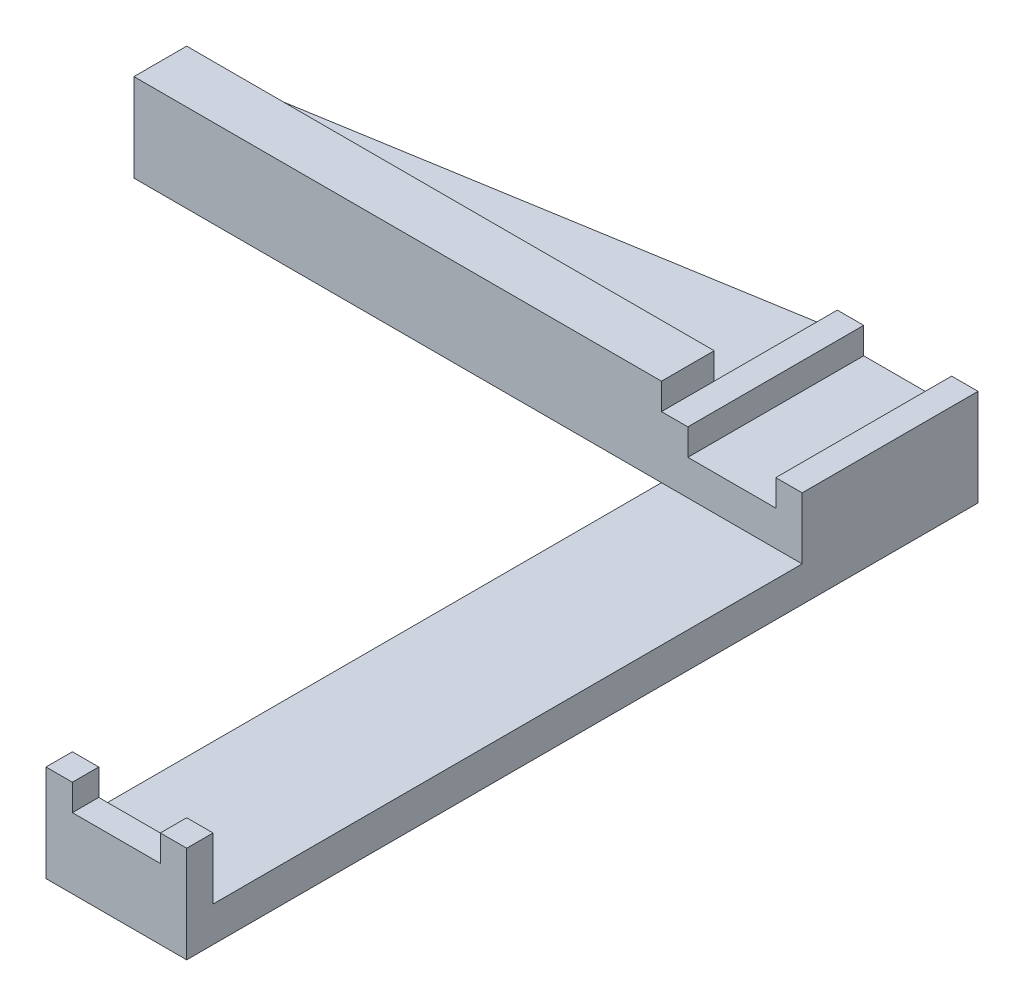
ISO-10303-21;
HEADER;
FILE_DESCRIPTION(('STEP AP214'),'2;1');
FILE_NAME('part.step','',(''),(''),'','','');
FILE_SCHEMA(('AUTOMOTIVE_DESIGN { 1 0 10303 214 1 1 1 1 }'));
ENDSEC;
DATA;
#1=APPLICATION_CONTEXT('core data for automotive mechanical design processes');
#2=APPLICATION_PROTOCOL_DEFINITION('international standard','automotive_design',2000,#1);
#3=PRODUCT_CONTEXT('',#1,'mechanical');
#4=PRODUCT('Part','Part','',(#3));
#5=PRODUCT_RELATED_PRODUCT_CATEGORY('part','',(#4));
#6=PRODUCT_DEFINITION_FORMATION('','',#4);
#7=PRODUCT_DEFINITION_CONTEXT('part definition',#1,'design');
#8=PRODUCT_DEFINITION('design','',#6,#7);
#9=PRODUCT_DEFINITION_SHAPE('','',#8);
#10=(LENGTH_UNIT() NAMED_UNIT(*) SI_UNIT(.MILLI.,.METRE.));
#11=(NAMED_UNIT(*) PLANE_ANGLE_UNIT() SI_UNIT($,.RADIAN.));
#12=(NAMED_UNIT(*) SI_UNIT($,.STERADIAN.) SOLID_ANGLE_UNIT());
#13=UNCERTAINTY_MEASURE_WITH_UNIT(LENGTH_MEASURE(1.E-05),#10,'distance_accuracy_value','');
#14=(GEOMETRIC_REPRESENTATION_CONTEXT(3) GLOBAL_UNCERTAINTY_ASSIGNED_CONTEXT((#13)) GLOBAL_UNIT_ASSIGNED_CONTEXT((#10,
#11,#12)) REPRESENTATION_CONTEXT('',''));
#15=CARTESIAN_POINT('',(0.,0.,0.));
#16=DIRECTION('',(0.,0.,1.));
#17=DIRECTION('',(1.,0.,0.));
#18=AXIS2_PLACEMENT_3D('',#15,#16,#17);
#19=CARTESIAN_POINT('',(30.,12.,-10.));
#20=DIRECTION('',(0.164398987305357,0.,0.986393923832144));
#21=DIRECTION('',(0.986393923832144,0.,-0.164398987305357));
#22=AXIS2_PLACEMENT_3D('',#19,#20,#21);
#23=PLANE('',#22);
#24=DIRECTION('',(-0.986393923832144,0.,0.164398987305357));
#25=VECTOR('',#24,1.);
#26=CARTESIAN_POINT('',(0.,4.5,-5.));
#27=LINE('',#26,#25);
#28=CARTESIAN_POINT('',(30.,4.5,-10.));
#29=VERTEX_POINT('',#28);
#30=CARTESIAN_POINT('',(0.,4.5,-5.));
#31=VERTEX_POINT('',#30);
#32=EDGE_CURVE('E195',#29,#31,#27,.T.);
#33=ORIENTED_EDGE('',*,*,#32,.F.);
#34=DIRECTION('',(0.,-1.,0.));
#35=VECTOR('',#34,1.);
#36=CARTESIAN_POINT('',(30.,12.,-10.));
#37=LINE('',#36,#35);
#38=CARTESIAN_POINT('',(30.,2.,-10.));
#39=VERTEX_POINT('',#38);
#40=EDGE_CURVE('E339',#29,#39,#37,.T.);
#41=ORIENTED_EDGE('',*,*,#40,.T.);
#42=DIRECTION('',(0.986393923832144,0.,-0.164398987305357));
#43=VECTOR('',#42,1.);
#44=CARTESIAN_POINT('',(30.,2.,-10.));
#45=LINE('',#44,#43);
#46=CARTESIAN_POINT('',(0.,2.,-5.));
#47=VERTEX_POINT('',#46);
#48=EDGE_CURVE('E220',#47,#39,#45,.T.);
#49=ORIENTED_EDGE('',*,*,#48,.F.);
#50=DIRECTION('',(0.,-1.,0.));
#51=VECTOR('',#50,1.);
#52=CARTESIAN_POINT('',(0.,12.,-5.));
#53=LINE('',#52,#51);
#54=EDGE_CURVE('E337',#31,#47,#53,.T.);
#55=ORIENTED_EDGE('',*,*,#54,.F.);
#56=EDGE_LOOP('',(#33,#41,#49,#55));
#57=FACE_BOUND('',#56,.T.);
#58=ADVANCED_FACE('F34',(#57),#23,.F.);
#59=CARTESIAN_POINT('',(0.,12.,-5.));
#60=DIRECTION('',(1.,0.,0.));
#61=DIRECTION('',(0.,0.,-1.));
#62=AXIS2_PLACEMENT_3D('',#59,#60,#61);
#63=PLANE('',#62);
#64=DIRECTION('',(0.,0.,1.));
#65=VECTOR('',#64,1.);
#66=CARTESIAN_POINT('',(0.,7.,-3.));
#67=LINE('',#66,#65);
#68=CARTESIAN_POINT('',(0.,7.,-3.));
#69=VERTEX_POINT('',#68);
#70=CARTESIAN_POINT('',(0.,7.,0.));
#71=VERTEX_POINT('',#70);
#72=EDGE_CURVE('E202',#69,#71,#67,.T.);
#73=ORIENTED_EDGE('',*,*,#72,.F.);
#74=DIRECTION('',(0.,1.,0.));
#75=VECTOR('',#74,1.);
#76=CARTESIAN_POINT('',(0.,4.5,-3.));
#77=LINE('',#76,#75);
#78=CARTESIAN_POINT('',(0.,4.5,-3.));
#79=VERTEX_POINT('',#78);
#80=EDGE_CURVE('E49',#79,#69,#77,.T.);
#81=ORIENTED_EDGE('',*,*,#80,.F.);
#82=DIRECTION('',(0.,0.,1.));
#83=VECTOR('',#82,1.);
#84=CARTESIAN_POINT('',(0.,4.5,-3.));
#85=LINE('',#84,#83);
#86=EDGE_CURVE('E190',#31,#79,#85,.T.);
#87=ORIENTED_EDGE('',*,*,#86,.F.);
#88=ORIENTED_EDGE('',*,*,#54,.T.);
#89=DIRECTION('',(0.,0.,-1.));
#90=VECTOR('',#89,1.);
#91=CARTESIAN_POINT('',(0.,2.,-5.));
#92=LINE('',#91,#90);
#93=CARTESIAN_POINT('',(0.,2.,0.));
#94=VERTEX_POINT('',#93);
#95=EDGE_CURVE('E217',#94,#47,#92,.T.);
#96=ORIENTED_EDGE('',*,*,#95,.F.);
#97=DIRECTION('',(0.,-1.,0.));
#98=VECTOR('',#97,1.);
#99=CARTESIAN_POINT('',(0.,12.,0.));
#100=LINE('',#99,#98);
#101=EDGE_CURVE('E347',#71,#94,#100,.T.);
#102=ORIENTED_EDGE('',*,*,#101,.F.);
#103=EDGE_LOOP('',(#73,#81,#87,#88,#96,#102));
#104=FACE_BOUND('',#103,.T.);
#105=ADVANCED_FACE('F36',(#104),#63,.F.);
#106=CARTESIAN_POINT('',(0.,12.,0.));
#107=DIRECTION('',(0.,0.,-1.));
#108=DIRECTION('',(-1.,0.,0.));
#109=AXIS2_PLACEMENT_3D('',#106,#107,#108);
#110=PLANE('',#109);
#111=DIRECTION('',(1.,0.,0.));
#112=VECTOR('',#111,1.);
#113=CARTESIAN_POINT('',(0.,7.,0.));
#114=LINE('',#113,#112);
#115=CARTESIAN_POINT('',(30.,7.,0.));
#116=VERTEX_POINT('',#115);
#117=EDGE_CURVE('E210',#71,#116,#114,.T.);
#118=ORIENTED_EDGE('',*,*,#117,.F.);
#119=ORIENTED_EDGE('',*,*,#101,.T.);
#120=DIRECTION('',(-1.,0.,0.));
#121=VECTOR('',#120,1.);
#122=CARTESIAN_POINT('',(0.,2.,0.));
#123=LINE('',#122,#121);
#124=CARTESIAN_POINT('',(30.,2.,0.));
#125=VERTEX_POINT('',#124);
#126=EDGE_CURVE('E225',#125,#94,#123,.T.);
#127=ORIENTED_EDGE('',*,*,#126,.F.);
#128=DIRECTION('',(-1.,0.,0.));
#129=VECTOR('',#128,1.);
#130=CARTESIAN_POINT('',(30.,2.,0.));
#131=LINE('',#130,#129);
#132=CARTESIAN_POINT('',(38.,2.,0.));
#133=VERTEX_POINT('',#132);
#134=EDGE_CURVE('E313',#133,#125,#131,.T.);
#135=ORIENTED_EDGE('',*,*,#134,.F.);
#136=DIRECTION('',(0.,1.,0.));
#137=VECTOR('',#136,1.);
#138=CARTESIAN_POINT('',(38.,2.,0.));
#139=LINE('',#138,#137);
#140=CARTESIAN_POINT('',(38.,5.5,0.));
#141=VERTEX_POINT('',#140);
#142=EDGE_CURVE('E317',#133,#141,#139,.T.);
#143=ORIENTED_EDGE('',*,*,#142,.T.);
#144=DIRECTION('',(1.,0.,0.));
#145=VECTOR('',#144,1.);
#146=CARTESIAN_POINT('',(0.,5.5,0.));
#147=LINE('',#146,#145);
#148=CARTESIAN_POINT('',(36.5,5.5,0.));
#149=VERTEX_POINT('',#148);
#150=EDGE_CURVE('E298',#149,#141,#147,.T.);
#151=ORIENTED_EDGE('',*,*,#150,.F.);
#152=DIRECTION('',(0.,1.,0.));
#153=VECTOR('',#152,1.);
#154=CARTESIAN_POINT('',(36.5,4.,0.));
#155=LINE('',#154,#153);
#156=CARTESIAN_POINT('',(36.5,4.,0.));
#157=VERTEX_POINT('',#156);
#158=EDGE_CURVE('E279',#157,#149,#155,.T.);
#159=ORIENTED_EDGE('',*,*,#158,.F.);
#160=DIRECTION('',(1.,0.,0.));
#161=VECTOR('',#160,1.);
#162=CARTESIAN_POINT('',(31.5,4.,0.));
#163=LINE('',#162,#161);
#164=CARTESIAN_POINT('',(31.5,4.,0.));
#165=VERTEX_POINT('',#164);
#166=EDGE_CURVE('E260',#165,#157,#163,.T.);
#167=ORIENTED_EDGE('',*,*,#166,.F.);
#168=DIRECTION('',(0.,1.,0.));
#169=VECTOR('',#168,1.);
#170=CARTESIAN_POINT('',(31.5,4.,0.));
#171=LINE('',#170,#169);
#172=CARTESIAN_POINT('',(31.5,5.5,0.));
#173=VERTEX_POINT('',#172);
#174=EDGE_CURVE('E270',#165,#173,#171,.T.);
#175=ORIENTED_EDGE('',*,*,#174,.T.);
#176=CARTESIAN_POINT('',(30.,5.5,0.));
#177=VERTEX_POINT('',#176);
#178=EDGE_CURVE('E299',#177,#173,#147,.T.);
#179=ORIENTED_EDGE('',*,*,#178,.F.);
#180=DIRECTION('',(0.,1.,0.));
#181=VECTOR('',#180,1.);
#182=CARTESIAN_POINT('',(30.,12.,0.));
#183=LINE('',#182,#181);
#184=EDGE_CURVE('E302',#177,#116,#183,.T.);
#185=ORIENTED_EDGE('',*,*,#184,.T.);
#186=EDGE_LOOP('',(#118,#119,#127,#135,#143,#151,#159,#167,#175,#179,#185));
#187=FACE_BOUND('',#186,.T.);
#188=ADVANCED_FACE('F406',(#187),#110,.F.);
#189=CARTESIAN_POINT('',(30.,5.5,-10.));
#190=DIRECTION('',(-1.,0.,0.));
#191=DIRECTION('',(0.,0.,1.));
#192=AXIS2_PLACEMENT_3D('',#189,#190,#191);
#193=PLANE('',#192);
#194=DIRECTION('',(0.,0.,1.));
#195=VECTOR('',#194,1.);
#196=CARTESIAN_POINT('',(30.,5.5,-10.));
#197=LINE('',#196,#195);
#198=CARTESIAN_POINT('',(30.,5.5,-3.));
#199=VERTEX_POINT('',#198);
#200=EDGE_CURVE('E287',#199,#177,#197,.T.);
#201=ORIENTED_EDGE('',*,*,#200,.F.);
#202=DIRECTION('',(0.,1.,0.));
#203=VECTOR('',#202,1.);
#204=CARTESIAN_POINT('',(30.,4.5,-3.));
#205=LINE('',#204,#203);
#206=CARTESIAN_POINT('',(30.,7.,-3.));
#207=VERTEX_POINT('',#206);
#208=EDGE_CURVE('E203',#199,#207,#205,.T.);
#209=ORIENTED_EDGE('',*,*,#208,.T.);
#210=DIRECTION('',(0.,0.,-1.));
#211=VECTOR('',#210,1.);
#212=CARTESIAN_POINT('',(30.,7.,-10.));
#213=LINE('',#212,#211);
#214=EDGE_CURVE('E214',#116,#207,#213,.T.);
#215=ORIENTED_EDGE('',*,*,#214,.F.);
#216=ORIENTED_EDGE('',*,*,#184,.F.);
#217=EDGE_LOOP('',(#201,#209,#215,#216));
#218=FACE_BOUND('',#217,.T.);
#219=ADVANCED_FACE('F425',(#218),#193,.F.);
#220=CARTESIAN_POINT('',(0.,5.5,0.));
#221=DIRECTION('',(0.,1.,0.));
#222=DIRECTION('',(0.,0.,1.));
#223=AXIS2_PLACEMENT_3D('',#220,#221,#222);
#224=PLANE('',#223);
#225=DIRECTION('',(0.,0.,1.));
#226=VECTOR('',#225,1.);
#227=CARTESIAN_POINT('',(31.5,5.5,33.5));
#228=LINE('',#227,#226);
#229=CARTESIAN_POINT('',(31.5,5.5,33.5));
#230=VERTEX_POINT('',#229);
#231=CARTESIAN_POINT('',(31.5,5.5,35.));
#232=VERTEX_POINT('',#231);
#233=EDGE_CURVE('E231',#230,#232,#228,.T.);
#234=ORIENTED_EDGE('',*,*,#233,.F.);
#235=DIRECTION('',(-1.,0.,0.));
#236=VECTOR('',#235,1.);
#237=CARTESIAN_POINT('',(30.,5.5,33.5));
#238=LINE('',#237,#236);
#239=CARTESIAN_POINT('',(30.,5.5,33.5));
#240=VERTEX_POINT('',#239);
#241=EDGE_CURVE('E42',#230,#240,#238,.T.);
#242=ORIENTED_EDGE('',*,*,#241,.T.);
#243=CARTESIAN_POINT('',(30.,5.5,35.));
#244=VERTEX_POINT('',#243);
#245=EDGE_CURVE('E275',#240,#244,#197,.T.);
#246=ORIENTED_EDGE('',*,*,#245,.T.);
#247=DIRECTION('',(1.,0.,0.));
#248=VECTOR('',#247,1.);
#249=CARTESIAN_POINT('',(30.,5.5,35.));
#250=LINE('',#249,#248);
#251=EDGE_CURVE('E288',#244,#232,#250,.T.);
#252=ORIENTED_EDGE('',*,*,#251,.T.);
#253=EDGE_LOOP('',(#234,#242,#246,#252));
#254=FACE_BOUND('',#253,.T.);
#255=ADVANCED_FACE('F355',(#254),#224,.T.);
#256=DIRECTION('',(0.,0.,1.));
#257=VECTOR('',#256,1.);
#258=CARTESIAN_POINT('',(31.5,5.5,-10.));
#259=LINE('',#258,#257);
#260=CARTESIAN_POINT('',(31.5,5.5,-10.));
#261=VERTEX_POINT('',#260);
#262=EDGE_CURVE('E250',#261,#173,#259,.T.);
#263=ORIENTED_EDGE('',*,*,#262,.F.);
#264=DIRECTION('',(-1.,0.,0.));
#265=VECTOR('',#264,1.);
#266=CARTESIAN_POINT('',(30.,5.5,-10.));
#267=LINE('',#266,#265);
#268=CARTESIAN_POINT('',(30.,5.5,-10.));
#269=VERTEX_POINT('',#268);
#270=EDGE_CURVE('E294',#261,#269,#267,.T.);
#271=ORIENTED_EDGE('',*,*,#270,.T.);
#272=EDGE_CURVE('E283',#269,#199,#197,.T.);
#273=ORIENTED_EDGE('',*,*,#272,.T.);
#274=ORIENTED_EDGE('',*,*,#200,.T.);
#275=ORIENTED_EDGE('',*,*,#178,.T.);
#276=EDGE_LOOP('',(#263,#271,#273,#274,#275));
#277=FACE_BOUND('',#276,.T.);
#278=ADVANCED_FACE('F424',(#277),#224,.T.);
#279=CARTESIAN_POINT('',(30.,12.,0.));
#280=DIRECTION('',(1.,0.,0.));
#281=DIRECTION('',(0.,0.,-1.));
#282=AXIS2_PLACEMENT_3D('',#279,#280,#281);
#283=PLANE('',#282);
#284=ORIENTED_EDGE('',*,*,#245,.F.);
#285=DIRECTION('',(0.,1.,0.));
#286=VECTOR('',#285,1.);
#287=CARTESIAN_POINT('',(30.,2.,33.5));
#288=LINE('',#287,#286);
#289=CARTESIAN_POINT('',(30.,2.,33.5));
#290=VERTEX_POINT('',#289);
#291=EDGE_CURVE('E316',#290,#240,#288,.T.);
#292=ORIENTED_EDGE('',*,*,#291,.F.);
#293=DIRECTION('',(0.,0.,1.));
#294=VECTOR('',#293,1.);
#295=CARTESIAN_POINT('',(30.,2.,0.));
#296=LINE('',#295,#294);
#297=EDGE_CURVE('E305',#125,#290,#296,.T.);
#298=ORIENTED_EDGE('',*,*,#297,.F.);
#299=DIRECTION('',(0.,0.,1.));
#300=VECTOR('',#299,1.);
#301=CARTESIAN_POINT('',(30.,2.,0.));
#302=LINE('',#301,#300);
#303=EDGE_CURVE('E223',#39,#125,#302,.T.);
#304=ORIENTED_EDGE('',*,*,#303,.F.);
#305=DIRECTION('',(0.,-1.,0.));
#306=VECTOR('',#305,1.);
#307=CARTESIAN_POINT('',(30.,2.,-10.));
#308=LINE('',#307,#306);
#309=CARTESIAN_POINT('',(30.,0.,-10.));
#310=VERTEX_POINT('',#309);
#311=EDGE_CURVE('E228',#39,#310,#308,.T.);
#312=ORIENTED_EDGE('',*,*,#311,.T.);
#313=DIRECTION('',(0.,0.,1.));
#314=VECTOR('',#313,1.);
#315=CARTESIAN_POINT('',(30.,0.,0.));
#316=LINE('',#315,#314);
#317=CARTESIAN_POINT('',(30.,0.,35.));
#318=VERTEX_POINT('',#317);
#319=EDGE_CURVE('E320',#310,#318,#316,.T.);
#320=ORIENTED_EDGE('',*,*,#319,.T.);
#321=DIRECTION('',(0.,-1.,0.));
#322=VECTOR('',#321,1.);
#323=CARTESIAN_POINT('',(30.,12.,35.));
#324=LINE('',#323,#322);
#325=EDGE_CURVE('E346',#244,#318,#324,.T.);
#326=ORIENTED_EDGE('',*,*,#325,.F.);
#327=EDGE_LOOP('',(#284,#292,#298,#304,#312,#320,#326));
#328=FACE_BOUND('',#327,.T.);
#329=ADVANCED_FACE('F362',(#328),#283,.F.);
#330=CARTESIAN_POINT('',(30.,12.,35.));
#331=DIRECTION('',(0.,0.,-1.));
#332=DIRECTION('',(-1.,0.,0.));
#333=AXIS2_PLACEMENT_3D('',#330,#331,#332);
#334=PLANE('',#333);
#335=DIRECTION('',(1.,0.,0.));
#336=VECTOR('',#335,1.);
#337=CARTESIAN_POINT('',(31.5,4.,35.));
#338=LINE('',#337,#336);
#339=CARTESIAN_POINT('',(31.5,4.,35.));
#340=VERTEX_POINT('',#339);
#341=CARTESIAN_POINT('',(36.5,4.,35.));
#342=VERTEX_POINT('',#341);
#343=EDGE_CURVE('E235',#340,#342,#338,.T.);
#344=ORIENTED_EDGE('',*,*,#343,.F.);
#345=DIRECTION('',(0.,1.,0.));
#346=VECTOR('',#345,1.);
#347=CARTESIAN_POINT('',(31.5,4.,35.));
#348=LINE('',#347,#346);
#349=EDGE_CURVE('E245',#340,#232,#348,.T.);
#350=ORIENTED_EDGE('',*,*,#349,.T.);
#351=ORIENTED_EDGE('',*,*,#251,.F.);
#352=ORIENTED_EDGE('',*,*,#325,.T.);
#353=DIRECTION('',(1.,0.,0.));
#354=VECTOR('',#353,1.);
#355=CARTESIAN_POINT('',(30.,0.,35.));
#356=LINE('',#355,#354);
#357=CARTESIAN_POINT('',(38.,0.,35.));
#358=VERTEX_POINT('',#357);
#359=EDGE_CURVE('E328',#318,#358,#356,.T.);
#360=ORIENTED_EDGE('',*,*,#359,.T.);
#361=DIRECTION('',(0.,-1.,0.));
#362=VECTOR('',#361,1.);
#363=CARTESIAN_POINT('',(38.,12.,35.));
#364=LINE('',#363,#362);
#365=CARTESIAN_POINT('',(38.,5.5,35.));
#366=VERTEX_POINT('',#365);
#367=EDGE_CURVE('E344',#366,#358,#364,.T.);
#368=ORIENTED_EDGE('',*,*,#367,.F.);
#369=CARTESIAN_POINT('',(36.5,5.5,35.));
#370=VERTEX_POINT('',#369);
#371=EDGE_CURVE('E286',#370,#366,#250,.T.);
#372=ORIENTED_EDGE('',*,*,#371,.F.);
#373=DIRECTION('',(0.,1.,0.));
#374=VECTOR('',#373,1.);
#375=CARTESIAN_POINT('',(36.5,4.,35.));
#376=LINE('',#375,#374);
#377=EDGE_CURVE('E57',#342,#370,#376,.T.);
#378=ORIENTED_EDGE('',*,*,#377,.F.);
#379=EDGE_LOOP('',(#344,#350,#351,#352,#360,#368,#372,#378));
#380=FACE_BOUND('',#379,.T.);
#381=ADVANCED_FACE('F392',(#380),#334,.F.);
#382=CARTESIAN_POINT('',(38.,12.,35.));
#383=DIRECTION('',(-1.,0.,0.));
#384=DIRECTION('',(0.,0.,1.));
#385=AXIS2_PLACEMENT_3D('',#382,#383,#384);
#386=PLANE('',#385);
#387=DIRECTION('',(0.,0.,-1.));
#388=VECTOR('',#387,1.);
#389=CARTESIAN_POINT('',(38.,5.5,-10.));
#390=LINE('',#389,#388);
#391=CARTESIAN_POINT('',(38.,5.5,33.5));
#392=VERTEX_POINT('',#391);
#393=EDGE_CURVE('E292',#366,#392,#390,.T.);
#394=ORIENTED_EDGE('',*,*,#393,.F.);
#395=ORIENTED_EDGE('',*,*,#367,.T.);
#396=DIRECTION('',(0.,0.,-1.));
#397=VECTOR('',#396,1.);
#398=CARTESIAN_POINT('',(38.,0.,35.));
#399=LINE('',#398,#397);
#400=CARTESIAN_POINT('',(38.,0.,-10.));
#401=VERTEX_POINT('',#400);
#402=EDGE_CURVE('E331',#358,#401,#399,.T.);
#403=ORIENTED_EDGE('',*,*,#402,.T.);
#404=DIRECTION('',(0.,-1.,0.));
#405=VECTOR('',#404,1.);
#406=CARTESIAN_POINT('',(38.,12.,-10.));
#407=LINE('',#406,#405);
#408=CARTESIAN_POINT('',(38.,5.5,-10.));
#409=VERTEX_POINT('',#408);
#410=EDGE_CURVE('E342',#409,#401,#407,.T.);
#411=ORIENTED_EDGE('',*,*,#410,.F.);
#412=EDGE_CURVE('E291',#141,#409,#390,.T.);
#413=ORIENTED_EDGE('',*,*,#412,.F.);
#414=ORIENTED_EDGE('',*,*,#142,.F.);
#415=DIRECTION('',(0.,0.,-1.));
#416=VECTOR('',#415,1.);
#417=CARTESIAN_POINT('',(38.,2.,0.));
#418=LINE('',#417,#416);
#419=CARTESIAN_POINT('',(38.,2.,33.5));
#420=VERTEX_POINT('',#419);
#421=EDGE_CURVE('E311',#420,#133,#418,.T.);
#422=ORIENTED_EDGE('',*,*,#421,.F.);
#423=DIRECTION('',(0.,1.,0.));
#424=VECTOR('',#423,1.);
#425=CARTESIAN_POINT('',(38.,2.,33.5));
#426=LINE('',#425,#424);
#427=EDGE_CURVE('E321',#420,#392,#426,.T.);
#428=ORIENTED_EDGE('',*,*,#427,.T.);
#429=EDGE_LOOP('',(#394,#395,#403,#411,#413,#414,#422,#428));
#430=FACE_BOUND('',#429,.T.);
#431=ADVANCED_FACE('F403',(#430),#386,.F.);
#432=CARTESIAN_POINT('',(38.,12.,-10.));
#433=DIRECTION('',(0.,0.,1.));
#434=DIRECTION('',(1.,0.,0.));
#435=AXIS2_PLACEMENT_3D('',#432,#433,#434);
#436=PLANE('',#435);
#437=ORIENTED_EDGE('',*,*,#270,.F.);
#438=DIRECTION('',(0.,1.,0.));
#439=VECTOR('',#438,1.);
#440=CARTESIAN_POINT('',(31.5,4.,-10.));
#441=LINE('',#440,#439);
#442=CARTESIAN_POINT('',(31.5,4.,-10.));
#443=VERTEX_POINT('',#442);
#444=EDGE_CURVE('E273',#443,#261,#441,.T.);
#445=ORIENTED_EDGE('',*,*,#444,.F.);
#446=DIRECTION('',(-1.,0.,0.));
#447=VECTOR('',#446,1.);
#448=CARTESIAN_POINT('',(31.5,4.,-10.));
#449=LINE('',#448,#447);
#450=CARTESIAN_POINT('',(36.5,4.,-10.));
#451=VERTEX_POINT('',#450);
#452=EDGE_CURVE('E267',#451,#443,#449,.T.);
#453=ORIENTED_EDGE('',*,*,#452,.F.);
#454=DIRECTION('',(0.,1.,0.));
#455=VECTOR('',#454,1.);
#456=CARTESIAN_POINT('',(36.5,4.,-10.));
#457=LINE('',#456,#455);
#458=CARTESIAN_POINT('',(36.5,5.5,-10.));
#459=VERTEX_POINT('',#458);
#460=EDGE_CURVE('E276',#451,#459,#457,.T.);
#461=ORIENTED_EDGE('',*,*,#460,.T.);
#462=EDGE_CURVE('E295',#409,#459,#267,.T.);
#463=ORIENTED_EDGE('',*,*,#462,.F.);
#464=ORIENTED_EDGE('',*,*,#410,.T.);
#465=DIRECTION('',(-1.,0.,0.));
#466=VECTOR('',#465,1.);
#467=CARTESIAN_POINT('',(38.,0.,-10.));
#468=LINE('',#467,#466);
#469=EDGE_CURVE('E334',#401,#310,#468,.T.);
#470=ORIENTED_EDGE('',*,*,#469,.T.);
#471=ORIENTED_EDGE('',*,*,#311,.F.);
#472=ORIENTED_EDGE('',*,*,#40,.F.);
#473=EDGE_CURVE('E341',#269,#29,#37,.T.);
#474=ORIENTED_EDGE('',*,*,#473,.F.);
#475=EDGE_LOOP('',(#437,#445,#453,#461,#463,#464,#470,#471,#472,#474));
#476=FACE_BOUND('',#475,.T.);
#477=ADVANCED_FACE('F380',(#476),#436,.F.);
#478=CARTESIAN_POINT('',(30.,2.,33.5));
#479=DIRECTION('',(0.,0.,1.));
#480=DIRECTION('',(1.,0.,0.));
#481=AXIS2_PLACEMENT_3D('',#478,#479,#480);
#482=PLANE('',#481);
#483=ORIENTED_EDGE('',*,*,#241,.F.);
#484=DIRECTION('',(0.,1.,0.));
#485=VECTOR('',#484,1.);
#486=CARTESIAN_POINT('',(31.5,4.,33.5));
#487=LINE('',#486,#485);
#488=CARTESIAN_POINT('',(31.5,4.,33.5));
#489=VERTEX_POINT('',#488);
#490=EDGE_CURVE('E248',#489,#230,#487,.T.);
#491=ORIENTED_EDGE('',*,*,#490,.F.);
#492=DIRECTION('',(-1.,0.,0.));
#493=VECTOR('',#492,1.);
#494=CARTESIAN_POINT('',(31.5,4.,33.5));
#495=LINE('',#494,#493);
#496=CARTESIAN_POINT('',(36.5,4.,33.5));
#497=VERTEX_POINT('',#496);
#498=EDGE_CURVE('E242',#497,#489,#495,.T.);
#499=ORIENTED_EDGE('',*,*,#498,.F.);
#500=DIRECTION('',(0.,1.,0.));
#501=VECTOR('',#500,1.);
#502=CARTESIAN_POINT('',(36.5,4.,33.5));
#503=LINE('',#502,#501);
#504=CARTESIAN_POINT('',(36.5,5.5,33.5));
#505=VERTEX_POINT('',#504);
#506=EDGE_CURVE('E251',#497,#505,#503,.T.);
#507=ORIENTED_EDGE('',*,*,#506,.T.);
#508=EDGE_CURVE('E11',#392,#505,#238,.T.);
#509=ORIENTED_EDGE('',*,*,#508,.F.);
#510=ORIENTED_EDGE('',*,*,#427,.F.);
#511=DIRECTION('',(1.,0.,0.));
#512=VECTOR('',#511,1.);
#513=CARTESIAN_POINT('',(30.,2.,33.5));
#514=LINE('',#513,#512);
#515=EDGE_CURVE('E308',#290,#420,#514,.T.);
#516=ORIENTED_EDGE('',*,*,#515,.F.);
#517=ORIENTED_EDGE('',*,*,#291,.T.);
#518=EDGE_LOOP('',(#483,#491,#499,#507,#509,#510,#516,#517));
#519=FACE_BOUND('',#518,.T.);
#520=ADVANCED_FACE('F364',(#519),#482,.F.);
#521=CARTESIAN_POINT('',(0.,0.,0.));
#522=DIRECTION('',(0.,1.,0.));
#523=DIRECTION('',(0.,0.,1.));
#524=AXIS2_PLACEMENT_3D('',#521,#522,#523);
#525=PLANE('',#524);
#526=ORIENTED_EDGE('',*,*,#319,.F.);
#527=ORIENTED_EDGE('',*,*,#469,.F.);
#528=ORIENTED_EDGE('',*,*,#402,.F.);
#529=ORIENTED_EDGE('',*,*,#359,.F.);
#530=EDGE_LOOP('',(#526,#527,#528,#529));
#531=FACE_BOUND('',#530,.T.);
#532=ADVANCED_FACE('F387',(#531),#525,.F.);
#533=CARTESIAN_POINT('',(0.,2.,0.));
#534=DIRECTION('',(0.,1.,0.));
#535=DIRECTION('',(0.,0.,1.));
#536=AXIS2_PLACEMENT_3D('',#533,#534,#535);
#537=PLANE('',#536);
#538=ORIENTED_EDGE('',*,*,#297,.T.);
#539=ORIENTED_EDGE('',*,*,#515,.T.);
#540=ORIENTED_EDGE('',*,*,#421,.T.);
#541=ORIENTED_EDGE('',*,*,#134,.T.);
#542=EDGE_LOOP('',(#538,#539,#540,#541));
#543=FACE_BOUND('',#542,.T.);
#544=ADVANCED_FACE('F368',(#543),#537,.T.);
#545=DIRECTION('',(0.,0.,-1.));
#546=VECTOR('',#545,1.);
#547=CARTESIAN_POINT('',(36.5,5.5,33.5));
#548=LINE('',#547,#546);
#549=EDGE_CURVE('E236',#370,#505,#548,.T.);
#550=ORIENTED_EDGE('',*,*,#549,.F.);
#551=ORIENTED_EDGE('',*,*,#371,.T.);
#552=ORIENTED_EDGE('',*,*,#393,.T.);
#553=ORIENTED_EDGE('',*,*,#508,.T.);
#554=EDGE_LOOP('',(#550,#551,#552,#553));
#555=FACE_BOUND('',#554,.T.);
#556=ADVANCED_FACE('F400',(#555),#224,.T.);
#557=DIRECTION('',(0.,0.,-1.));
#558=VECTOR('',#557,1.);
#559=CARTESIAN_POINT('',(36.5,5.5,-10.));
#560=LINE('',#559,#558);
#561=EDGE_CURVE('E261',#149,#459,#560,.T.);
#562=ORIENTED_EDGE('',*,*,#561,.F.);
#563=ORIENTED_EDGE('',*,*,#150,.T.);
#564=ORIENTED_EDGE('',*,*,#412,.T.);
#565=ORIENTED_EDGE('',*,*,#462,.T.);
#566=EDGE_LOOP('',(#562,#563,#564,#565));
#567=FACE_BOUND('',#566,.T.);
#568=ADVANCED_FACE('F437',(#567),#224,.T.);
#569=CARTESIAN_POINT('',(31.5,4.,-10.));
#570=DIRECTION('',(-1.,0.,0.));
#571=DIRECTION('',(0.,0.,1.));
#572=AXIS2_PLACEMENT_3D('',#569,#570,#571);
#573=PLANE('',#572);
#574=ORIENTED_EDGE('',*,*,#262,.T.);
#575=ORIENTED_EDGE('',*,*,#174,.F.);
#576=DIRECTION('',(0.,0.,1.));
#577=VECTOR('',#576,1.);
#578=CARTESIAN_POINT('',(31.5,4.,-10.));
#579=LINE('',#578,#577);
#580=EDGE_CURVE('E257',#443,#165,#579,.T.);
#581=ORIENTED_EDGE('',*,*,#580,.F.);
#582=ORIENTED_EDGE('',*,*,#444,.T.);
#583=EDGE_LOOP('',(#574,#575,#581,#582));
#584=FACE_BOUND('',#583,.T.);
#585=ADVANCED_FACE('F536',(#584),#573,.F.);
#586=CARTESIAN_POINT('',(36.5,4.,-10.));
#587=DIRECTION('',(1.,0.,0.));
#588=DIRECTION('',(0.,0.,-1.));
#589=AXIS2_PLACEMENT_3D('',#586,#587,#588);
#590=PLANE('',#589);
#591=ORIENTED_EDGE('',*,*,#561,.T.);
#592=ORIENTED_EDGE('',*,*,#460,.F.);
#593=DIRECTION('',(0.,0.,-1.));
#594=VECTOR('',#593,1.);
#595=CARTESIAN_POINT('',(36.5,4.,-10.));
#596=LINE('',#595,#594);
#597=EDGE_CURVE('E264',#157,#451,#596,.T.);
#598=ORIENTED_EDGE('',*,*,#597,.F.);
#599=ORIENTED_EDGE('',*,*,#158,.T.);
#600=EDGE_LOOP('',(#591,#592,#598,#599));
#601=FACE_BOUND('',#600,.T.);
#602=ADVANCED_FACE('F533',(#601),#590,.F.);
#603=CARTESIAN_POINT('',(0.,4.,0.));
#604=DIRECTION('',(0.,1.,0.));
#605=DIRECTION('',(0.,0.,1.));
#606=AXIS2_PLACEMENT_3D('',#603,#604,#605);
#607=PLANE('',#606);
#608=ORIENTED_EDGE('',*,*,#580,.T.);
#609=ORIENTED_EDGE('',*,*,#166,.T.);
#610=ORIENTED_EDGE('',*,*,#597,.T.);
#611=ORIENTED_EDGE('',*,*,#452,.T.);
#612=EDGE_LOOP('',(#608,#609,#610,#611));
#613=FACE_BOUND('',#612,.T.);
#614=ADVANCED_FACE('F530',(#613),#607,.T.);
#615=CARTESIAN_POINT('',(31.5,4.,33.5));
#616=DIRECTION('',(-1.,0.,0.));
#617=DIRECTION('',(0.,0.,1.));
#618=AXIS2_PLACEMENT_3D('',#615,#616,#617);
#619=PLANE('',#618);
#620=ORIENTED_EDGE('',*,*,#233,.T.);
#621=ORIENTED_EDGE('',*,*,#349,.F.);
#622=DIRECTION('',(0.,0.,1.));
#623=VECTOR('',#622,1.);
#624=CARTESIAN_POINT('',(31.5,4.,33.5));
#625=LINE('',#624,#623);
#626=EDGE_CURVE('E232',#489,#340,#625,.T.);
#627=ORIENTED_EDGE('',*,*,#626,.F.);
#628=ORIENTED_EDGE('',*,*,#490,.T.);
#629=EDGE_LOOP('',(#620,#621,#627,#628));
#630=FACE_BOUND('',#629,.T.);
#631=ADVANCED_FACE('F395',(#630),#619,.F.);
#632=CARTESIAN_POINT('',(36.5,4.,33.5));
#633=DIRECTION('',(1.,0.,0.));
#634=DIRECTION('',(0.,0.,-1.));
#635=AXIS2_PLACEMENT_3D('',#632,#633,#634);
#636=PLANE('',#635);
#637=ORIENTED_EDGE('',*,*,#549,.T.);
#638=ORIENTED_EDGE('',*,*,#506,.F.);
#639=DIRECTION('',(0.,0.,-1.));
#640=VECTOR('',#639,1.);
#641=CARTESIAN_POINT('',(36.5,4.,33.5));
#642=LINE('',#641,#640);
#643=EDGE_CURVE('E239',#342,#497,#642,.T.);
#644=ORIENTED_EDGE('',*,*,#643,.F.);
#645=ORIENTED_EDGE('',*,*,#377,.T.);
#646=EDGE_LOOP('',(#637,#638,#644,#645));
#647=FACE_BOUND('',#646,.T.);
#648=ADVANCED_FACE('F525',(#647),#636,.F.);
#649=CARTESIAN_POINT('',(0.,4.,0.));
#650=DIRECTION('',(0.,1.,0.));
#651=DIRECTION('',(0.,0.,1.));
#652=AXIS2_PLACEMENT_3D('',#649,#650,#651);
#653=PLANE('',#652);
#654=ORIENTED_EDGE('',*,*,#626,.T.);
#655=ORIENTED_EDGE('',*,*,#343,.T.);
#656=ORIENTED_EDGE('',*,*,#643,.T.);
#657=ORIENTED_EDGE('',*,*,#498,.T.);
#658=EDGE_LOOP('',(#654,#655,#656,#657));
#659=FACE_BOUND('',#658,.T.);
#660=ADVANCED_FACE('F397',(#659),#653,.T.);
#661=CARTESIAN_POINT('',(0.,2.,0.));
#662=DIRECTION('',(0.,1.,0.));
#663=DIRECTION('',(0.,0.,1.));
#664=AXIS2_PLACEMENT_3D('',#661,#662,#663);
#665=PLANE('',#664);
#666=ORIENTED_EDGE('',*,*,#95,.T.);
#667=ORIENTED_EDGE('',*,*,#48,.T.);
#668=ORIENTED_EDGE('',*,*,#303,.T.);
#669=ORIENTED_EDGE('',*,*,#126,.T.);
#670=EDGE_LOOP('',(#666,#667,#668,#669));
#671=FACE_BOUND('',#670,.T.);
#672=ADVANCED_FACE('F374',(#671),#665,.F.);
#673=CARTESIAN_POINT('',(0.,7.,0.));
#674=DIRECTION('',(0.,1.,0.));
#675=DIRECTION('',(0.,0.,1.));
#676=AXIS2_PLACEMENT_3D('',#673,#674,#675);
#677=PLANE('',#676);
#678=DIRECTION('',(1.,0.,0.));
#679=VECTOR('',#678,1.);
#680=CARTESIAN_POINT('',(30.,7.,-3.));
#681=LINE('',#680,#679);
#682=EDGE_CURVE('E198',#69,#207,#681,.T.);
#683=ORIENTED_EDGE('',*,*,#682,.F.);
#684=ORIENTED_EDGE('',*,*,#72,.T.);
#685=ORIENTED_EDGE('',*,*,#117,.T.);
#686=ORIENTED_EDGE('',*,*,#214,.T.);
#687=EDGE_LOOP('',(#683,#684,#685,#686));
#688=FACE_BOUND('',#687,.T.);
#689=ADVANCED_FACE('F463',(#688),#677,.T.);
#690=CARTESIAN_POINT('',(30.,4.5,-10.));
#691=DIRECTION('',(1.,0.,0.));
#692=DIRECTION('',(0.,0.,-1.));
#693=AXIS2_PLACEMENT_3D('',#690,#691,#692);
#694=PLANE('',#693);
#695=ORIENTED_EDGE('',*,*,#272,.F.);
#696=ORIENTED_EDGE('',*,*,#473,.T.);
#697=DIRECTION('',(0.,0.,-1.));
#698=VECTOR('',#697,1.);
#699=CARTESIAN_POINT('',(30.,4.5,-10.));
#700=LINE('',#699,#698);
#701=CARTESIAN_POINT('',(30.,4.5,-3.));
#702=VERTEX_POINT('',#701);
#703=EDGE_CURVE('E189',#702,#29,#700,.T.);
#704=ORIENTED_EDGE('',*,*,#703,.F.);
#705=EDGE_CURVE('E185',#702,#199,#205,.T.);
#706=ORIENTED_EDGE('',*,*,#705,.T.);
#707=EDGE_LOOP('',(#695,#696,#704,#706));
#708=FACE_BOUND('',#707,.T.);
#709=ADVANCED_FACE('F496',(#708),#694,.F.);
#710=CARTESIAN_POINT('',(30.,4.5,-3.));
#711=DIRECTION('',(0.,0.,1.));
#712=DIRECTION('',(1.,0.,0.));
#713=AXIS2_PLACEMENT_3D('',#710,#711,#712);
#714=PLANE('',#713);
#715=ORIENTED_EDGE('',*,*,#682,.T.);
#716=ORIENTED_EDGE('',*,*,#208,.F.);
#717=ORIENTED_EDGE('',*,*,#705,.F.);
#718=DIRECTION('',(1.,0.,0.));
#719=VECTOR('',#718,1.);
#720=CARTESIAN_POINT('',(30.,4.5,-3.));
#721=LINE('',#720,#719);
#722=EDGE_CURVE('E181',#79,#702,#721,.T.);
#723=ORIENTED_EDGE('',*,*,#722,.F.);
#724=ORIENTED_EDGE('',*,*,#80,.T.);
#725=EDGE_LOOP('',(#715,#716,#717,#723,#724));
#726=FACE_BOUND('',#725,.T.);
#727=ADVANCED_FACE('F183',(#726),#714,.F.);
#728=CARTESIAN_POINT('',(0.,4.5,0.));
#729=DIRECTION('',(0.,1.,0.));
#730=DIRECTION('',(0.,0.,1.));
#731=AXIS2_PLACEMENT_3D('',#728,#729,#730);
#732=PLANE('',#731);
#733=ORIENTED_EDGE('',*,*,#86,.T.);
#734=ORIENTED_EDGE('',*,*,#722,.T.);
#735=ORIENTED_EDGE('',*,*,#703,.T.);
#736=ORIENTED_EDGE('',*,*,#32,.T.);
#737=EDGE_LOOP('',(#733,#734,#735,#736));
#738=FACE_BOUND('',#737,.T.);
#739=ADVANCED_FACE('F193',(#738),#732,.T.);
#740=CLOSED_SHELL('',(#58,#105,#188,#219,#255,#278,#329,#381,#431,#477,#520,#532,#544,#556,#568,
#585,#602,#614,#631,#648,#660,#672,#689,#709,#727,#739));
#741=MANIFOLD_SOLID_BREP('B2',#740);
#742=ADVANCED_BREP_SHAPE_REPRESENTATION('',(#18,#741),#14);
#743=SHAPE_DEFINITION_REPRESENTATION(#9,#742);
ENDSEC;
END-ISO-10303-21;
